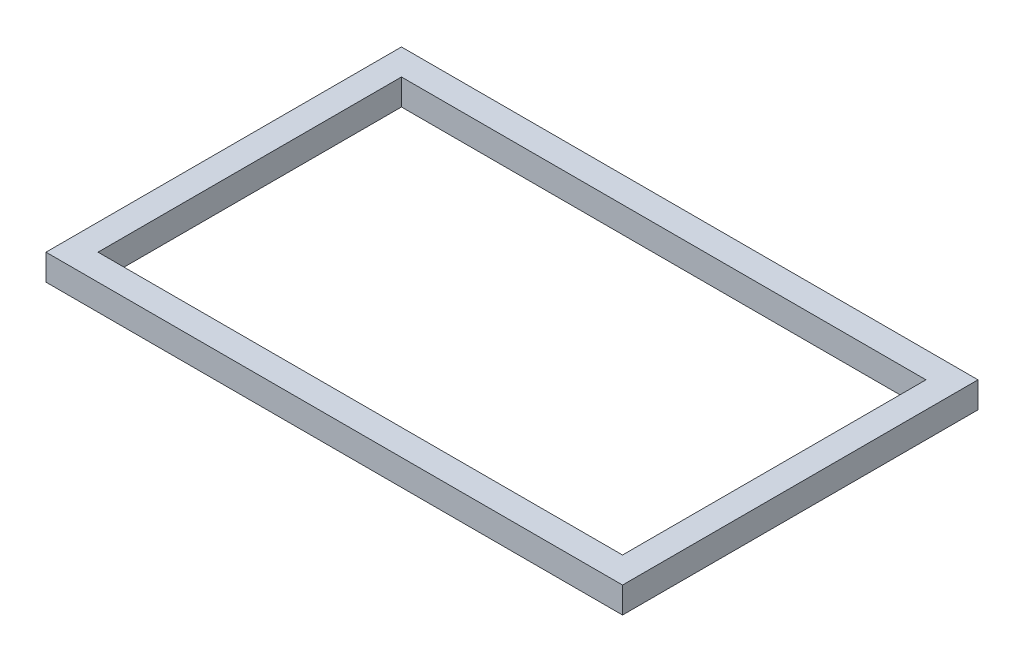
ISO-10303-21;
HEADER;
FILE_DESCRIPTION(('STEP AP214'),'2;1');
FILE_NAME('part.step','',(''),(''),'','','');
FILE_SCHEMA(('AUTOMOTIVE_DESIGN { 1 0 10303 214 1 1 1 1 }'));
ENDSEC;
DATA;
#1=APPLICATION_CONTEXT('core data for automotive mechanical design processes');
#2=APPLICATION_PROTOCOL_DEFINITION('international standard','automotive_design',2000,#1);
#3=PRODUCT_CONTEXT('',#1,'mechanical');
#4=PRODUCT('Part','Part','',(#3));
#5=PRODUCT_RELATED_PRODUCT_CATEGORY('part','',(#4));
#6=PRODUCT_DEFINITION_FORMATION('','',#4);
#7=PRODUCT_DEFINITION_CONTEXT('part definition',#1,'design');
#8=PRODUCT_DEFINITION('design','',#6,#7);
#9=PRODUCT_DEFINITION_SHAPE('','',#8);
#10=(LENGTH_UNIT() NAMED_UNIT(*) SI_UNIT(.MILLI.,.METRE.));
#11=(NAMED_UNIT(*) PLANE_ANGLE_UNIT() SI_UNIT($,.RADIAN.));
#12=(NAMED_UNIT(*) SI_UNIT($,.STERADIAN.) SOLID_ANGLE_UNIT());
#13=UNCERTAINTY_MEASURE_WITH_UNIT(LENGTH_MEASURE(1.E-05),#10,'distance_accuracy_value','');
#14=(GEOMETRIC_REPRESENTATION_CONTEXT(3) GLOBAL_UNCERTAINTY_ASSIGNED_CONTEXT((#13)) GLOBAL_UNIT_ASSIGNED_CONTEXT((#10,
#11,#12)) REPRESENTATION_CONTEXT('',''));
#15=CARTESIAN_POINT('',(0.,0.,0.));
#16=DIRECTION('',(0.,0.,1.));
#17=DIRECTION('',(1.,0.,0.));
#18=AXIS2_PLACEMENT_3D('',#15,#16,#17);
#19=CARTESIAN_POINT('',(0.,18.,0.));
#20=DIRECTION('',(0.,1.,0.));
#21=DIRECTION('',(0.,0.,1.));
#22=AXIS2_PLACEMENT_3D('',#19,#20,#21);
#23=PLANE('',#22);
#24=DIRECTION('',(0.,0.,1.));
#25=VECTOR('',#24,1.);
#26=CARTESIAN_POINT('',(-149.426787880863,18.,-98.2958552607932));
#27=LINE('',#26,#25);
#28=CARTESIAN_POINT('',(-149.426787880863,18.,-98.2958552607932));
#29=VERTEX_POINT('',#28);
#30=CARTESIAN_POINT('',(-149.426787880863,18.,147.704144739207));
#31=VERTEX_POINT('',#30);
#32=EDGE_CURVE('E153',#29,#31,#27,.T.);
#33=ORIENTED_EDGE('',*,*,#32,.T.);
#34=DIRECTION('',(1.,0.,0.));
#35=VECTOR('',#34,1.);
#36=CARTESIAN_POINT('',(-149.426787880863,18.,147.704144739207));
#37=LINE('',#36,#35);
#38=CARTESIAN_POINT('',(249.573212119137,18.,147.704144739207));
#39=VERTEX_POINT('',#38);
#40=EDGE_CURVE('E157',#31,#39,#37,.T.);
#41=ORIENTED_EDGE('',*,*,#40,.T.);
#42=DIRECTION('',(0.,0.,-1.));
#43=VECTOR('',#42,1.);
#44=CARTESIAN_POINT('',(249.573212119137,18.,-98.2958552607932));
#45=LINE('',#44,#43);
#46=CARTESIAN_POINT('',(249.573212119137,18.,-98.2958552607932));
#47=VERTEX_POINT('',#46);
#48=EDGE_CURVE('E161',#39,#47,#45,.T.);
#49=ORIENTED_EDGE('',*,*,#48,.T.);
#50=DIRECTION('',(-1.,0.,0.));
#51=VECTOR('',#50,1.);
#52=CARTESIAN_POINT('',(-149.426787880863,18.,-98.2958552607932));
#53=LINE('',#52,#51);
#54=EDGE_CURVE('E164',#47,#29,#53,.T.);
#55=ORIENTED_EDGE('',*,*,#54,.T.);
#56=EDGE_LOOP('',(#33,#41,#49,#55));
#57=FACE_BOUND('',#56,.T.);
#58=DIRECTION('',(0.,0.,1.));
#59=VECTOR('',#58,1.);
#60=CARTESIAN_POINT('',(-131.426787880863,18.,-80.2958552607932));
#61=LINE('',#60,#59);
#62=CARTESIAN_POINT('',(-131.426787880863,18.,-80.2958552607932));
#63=VERTEX_POINT('',#62);
#64=CARTESIAN_POINT('',(-131.426787880863,18.,129.704144739207));
#65=VERTEX_POINT('',#64);
#66=EDGE_CURVE('E114',#63,#65,#61,.T.);
#67=ORIENTED_EDGE('',*,*,#66,.F.);
#68=DIRECTION('',(-1.,0.,0.));
#69=VECTOR('',#68,1.);
#70=CARTESIAN_POINT('',(-131.426787880863,18.,-80.2958552607932));
#71=LINE('',#70,#69);
#72=CARTESIAN_POINT('',(231.573212119137,18.,-80.2958552607932));
#73=VERTEX_POINT('',#72);
#74=EDGE_CURVE('E105',#73,#63,#71,.T.);
#75=ORIENTED_EDGE('',*,*,#74,.F.);
#76=DIRECTION('',(0.,0.,-1.));
#77=VECTOR('',#76,1.);
#78=CARTESIAN_POINT('',(231.573212119137,18.,-80.2958552607932));
#79=LINE('',#78,#77);
#80=CARTESIAN_POINT('',(231.573212119137,18.,129.704144739207));
#81=VERTEX_POINT('',#80);
#82=EDGE_CURVE('E131',#81,#73,#79,.T.);
#83=ORIENTED_EDGE('',*,*,#82,.F.);
#84=DIRECTION('',(1.,0.,0.));
#85=VECTOR('',#84,1.);
#86=CARTESIAN_POINT('',(-131.426787880863,18.,129.704144739207));
#87=LINE('',#86,#85);
#88=EDGE_CURVE('E127',#65,#81,#87,.T.);
#89=ORIENTED_EDGE('',*,*,#88,.F.);
#90=EDGE_LOOP('',(#67,#75,#83,#89));
#91=FACE_BOUND('',#90,.T.);
#92=ADVANCED_FACE('F39',(#57,#91),#23,.T.);
#93=CARTESIAN_POINT('',(0.,0.,0.));
#94=DIRECTION('',(0.,1.,0.));
#95=DIRECTION('',(0.,0.,1.));
#96=AXIS2_PLACEMENT_3D('',#93,#94,#95);
#97=PLANE('',#96);
#98=DIRECTION('',(0.,0.,1.));
#99=VECTOR('',#98,1.);
#100=CARTESIAN_POINT('',(-149.426787880863,0.,-98.2958552607932));
#101=LINE('',#100,#99);
#102=CARTESIAN_POINT('',(-149.426787880863,0.,-98.2958552607932));
#103=VERTEX_POINT('',#102);
#104=CARTESIAN_POINT('',(-149.426787880863,0.,147.704144739207));
#105=VERTEX_POINT('',#104);
#106=EDGE_CURVE('E123',#103,#105,#101,.T.);
#107=ORIENTED_EDGE('',*,*,#106,.F.);
#108=DIRECTION('',(-1.,0.,0.));
#109=VECTOR('',#108,1.);
#110=CARTESIAN_POINT('',(-149.426787880863,0.,-98.2958552607932));
#111=LINE('',#110,#109);
#112=CARTESIAN_POINT('',(249.573212119137,0.,-98.2958552607932));
#113=VERTEX_POINT('',#112);
#114=EDGE_CURVE('E158',#113,#103,#111,.T.);
#115=ORIENTED_EDGE('',*,*,#114,.F.);
#116=DIRECTION('',(0.,0.,-1.));
#117=VECTOR('',#116,1.);
#118=CARTESIAN_POINT('',(249.573212119137,0.,-98.2958552607932));
#119=LINE('',#118,#117);
#120=CARTESIAN_POINT('',(249.573212119137,0.,147.704144739207));
#121=VERTEX_POINT('',#120);
#122=EDGE_CURVE('E174',#121,#113,#119,.T.);
#123=ORIENTED_EDGE('',*,*,#122,.F.);
#124=DIRECTION('',(1.,0.,0.));
#125=VECTOR('',#124,1.);
#126=CARTESIAN_POINT('',(-149.426787880863,0.,147.704144739207));
#127=LINE('',#126,#125);
#128=EDGE_CURVE('E171',#105,#121,#127,.T.);
#129=ORIENTED_EDGE('',*,*,#128,.F.);
#130=EDGE_LOOP('',(#107,#115,#123,#129));
#131=FACE_BOUND('',#130,.T.);
#132=DIRECTION('',(-1.,0.,0.));
#133=VECTOR('',#132,1.);
#134=CARTESIAN_POINT('',(-131.426787880863,0.,-80.2958552607932));
#135=LINE('',#134,#133);
#136=CARTESIAN_POINT('',(231.573212119137,0.,-80.2958552607932));
#137=VERTEX_POINT('',#136);
#138=CARTESIAN_POINT('',(-131.426787880863,0.,-80.2958552607932));
#139=VERTEX_POINT('',#138);
#140=EDGE_CURVE('E63',#137,#139,#135,.T.);
#141=ORIENTED_EDGE('',*,*,#140,.T.);
#142=DIRECTION('',(0.,0.,1.));
#143=VECTOR('',#142,1.);
#144=CARTESIAN_POINT('',(-131.426787880863,0.,-80.2958552607932));
#145=LINE('',#144,#143);
#146=CARTESIAN_POINT('',(-131.426787880863,0.,129.704144739207));
#147=VERTEX_POINT('',#146);
#148=EDGE_CURVE('E121',#139,#147,#145,.T.);
#149=ORIENTED_EDGE('',*,*,#148,.T.);
#150=DIRECTION('',(1.,0.,0.));
#151=VECTOR('',#150,1.);
#152=CARTESIAN_POINT('',(-131.426787880863,0.,129.704144739207));
#153=LINE('',#152,#151);
#154=CARTESIAN_POINT('',(231.573212119137,0.,129.704144739207));
#155=VERTEX_POINT('',#154);
#156=EDGE_CURVE('E140',#147,#155,#153,.T.);
#157=ORIENTED_EDGE('',*,*,#156,.T.);
#158=DIRECTION('',(0.,0.,-1.));
#159=VECTOR('',#158,1.);
#160=CARTESIAN_POINT('',(231.573212119137,0.,-80.2958552607932));
#161=LINE('',#160,#159);
#162=EDGE_CURVE('E115',#155,#137,#161,.T.);
#163=ORIENTED_EDGE('',*,*,#162,.T.);
#164=EDGE_LOOP('',(#141,#149,#157,#163));
#165=FACE_BOUND('',#164,.T.);
#166=ADVANCED_FACE('F197',(#131,#165),#97,.F.);
#167=CARTESIAN_POINT('',(-149.426787880863,18.,-98.2958552607932));
#168=DIRECTION('',(1.,0.,0.));
#169=DIRECTION('',(0.,0.,-1.));
#170=AXIS2_PLACEMENT_3D('',#167,#168,#169);
#171=PLANE('',#170);
#172=ORIENTED_EDGE('',*,*,#106,.T.);
#173=DIRECTION('',(0.,-1.,0.));
#174=VECTOR('',#173,1.);
#175=CARTESIAN_POINT('',(-149.426787880863,18.,147.704144739207));
#176=LINE('',#175,#174);
#177=EDGE_CURVE('E11',#31,#105,#176,.T.);
#178=ORIENTED_EDGE('',*,*,#177,.F.);
#179=ORIENTED_EDGE('',*,*,#32,.F.);
#180=DIRECTION('',(0.,-1.,0.));
#181=VECTOR('',#180,1.);
#182=CARTESIAN_POINT('',(-149.426787880863,18.,-98.2958552607932));
#183=LINE('',#182,#181);
#184=EDGE_CURVE('E167',#29,#103,#183,.T.);
#185=ORIENTED_EDGE('',*,*,#184,.T.);
#186=EDGE_LOOP('',(#172,#178,#179,#185));
#187=FACE_BOUND('',#186,.T.);
#188=ADVANCED_FACE('F41',(#187),#171,.F.);
#189=CARTESIAN_POINT('',(-149.426787880863,18.,147.704144739207));
#190=DIRECTION('',(0.,0.,-1.));
#191=DIRECTION('',(-1.,0.,0.));
#192=AXIS2_PLACEMENT_3D('',#189,#190,#191);
#193=PLANE('',#192);
#194=ORIENTED_EDGE('',*,*,#128,.T.);
#195=DIRECTION('',(0.,-1.,0.));
#196=VECTOR('',#195,1.);
#197=CARTESIAN_POINT('',(249.573212119137,18.,147.704144739207));
#198=LINE('',#197,#196);
#199=EDGE_CURVE('E48',#39,#121,#198,.T.);
#200=ORIENTED_EDGE('',*,*,#199,.F.);
#201=ORIENTED_EDGE('',*,*,#40,.F.);
#202=ORIENTED_EDGE('',*,*,#177,.T.);
#203=EDGE_LOOP('',(#194,#200,#201,#202));
#204=FACE_BOUND('',#203,.T.);
#205=ADVANCED_FACE('F207',(#204),#193,.F.);
#206=CARTESIAN_POINT('',(249.573212119137,18.,-98.2958552607932));
#207=DIRECTION('',(-1.,0.,0.));
#208=DIRECTION('',(0.,0.,1.));
#209=AXIS2_PLACEMENT_3D('',#206,#207,#208);
#210=PLANE('',#209);
#211=ORIENTED_EDGE('',*,*,#122,.T.);
#212=DIRECTION('',(0.,-1.,0.));
#213=VECTOR('',#212,1.);
#214=CARTESIAN_POINT('',(249.573212119137,18.,-98.2958552607932));
#215=LINE('',#214,#213);
#216=EDGE_CURVE('E182',#47,#113,#215,.T.);
#217=ORIENTED_EDGE('',*,*,#216,.F.);
#218=ORIENTED_EDGE('',*,*,#48,.F.);
#219=ORIENTED_EDGE('',*,*,#199,.T.);
#220=EDGE_LOOP('',(#211,#217,#218,#219));
#221=FACE_BOUND('',#220,.T.);
#222=ADVANCED_FACE('F191',(#221),#210,.F.);
#223=CARTESIAN_POINT('',(-149.426787880863,18.,-98.2958552607932));
#224=DIRECTION('',(0.,0.,1.));
#225=DIRECTION('',(1.,0.,0.));
#226=AXIS2_PLACEMENT_3D('',#223,#224,#225);
#227=PLANE('',#226);
#228=ORIENTED_EDGE('',*,*,#114,.T.);
#229=ORIENTED_EDGE('',*,*,#184,.F.);
#230=ORIENTED_EDGE('',*,*,#54,.F.);
#231=ORIENTED_EDGE('',*,*,#216,.T.);
#232=EDGE_LOOP('',(#228,#229,#230,#231));
#233=FACE_BOUND('',#232,.T.);
#234=ADVANCED_FACE('F201',(#233),#227,.F.);
#235=CARTESIAN_POINT('',(-131.426787880863,18.,-80.2958552607932));
#236=DIRECTION('',(0.,0.,1.));
#237=DIRECTION('',(1.,0.,0.));
#238=AXIS2_PLACEMENT_3D('',#235,#236,#237);
#239=PLANE('',#238);
#240=ORIENTED_EDGE('',*,*,#140,.F.);
#241=DIRECTION('',(0.,-1.,0.));
#242=VECTOR('',#241,1.);
#243=CARTESIAN_POINT('',(231.573212119137,18.,-80.2958552607932));
#244=LINE('',#243,#242);
#245=EDGE_CURVE('E109',#73,#137,#244,.T.);
#246=ORIENTED_EDGE('',*,*,#245,.F.);
#247=ORIENTED_EDGE('',*,*,#74,.T.);
#248=DIRECTION('',(0.,-1.,0.));
#249=VECTOR('',#248,1.);
#250=CARTESIAN_POINT('',(-131.426787880863,18.,-80.2958552607932));
#251=LINE('',#250,#249);
#252=EDGE_CURVE('E108',#63,#139,#251,.T.);
#253=ORIENTED_EDGE('',*,*,#252,.T.);
#254=EDGE_LOOP('',(#240,#246,#247,#253));
#255=FACE_BOUND('',#254,.T.);
#256=ADVANCED_FACE('F107',(#255),#239,.T.);
#257=CARTESIAN_POINT('',(-131.426787880863,18.,-80.2958552607932));
#258=DIRECTION('',(1.,0.,0.));
#259=DIRECTION('',(0.,0.,-1.));
#260=AXIS2_PLACEMENT_3D('',#257,#258,#259);
#261=PLANE('',#260);
#262=ORIENTED_EDGE('',*,*,#148,.F.);
#263=ORIENTED_EDGE('',*,*,#252,.F.);
#264=ORIENTED_EDGE('',*,*,#66,.T.);
#265=DIRECTION('',(0.,-1.,0.));
#266=VECTOR('',#265,1.);
#267=CARTESIAN_POINT('',(-131.426787880863,18.,129.704144739207));
#268=LINE('',#267,#266);
#269=EDGE_CURVE('E124',#65,#147,#268,.T.);
#270=ORIENTED_EDGE('',*,*,#269,.T.);
#271=EDGE_LOOP('',(#262,#263,#264,#270));
#272=FACE_BOUND('',#271,.T.);
#273=ADVANCED_FACE('F118',(#272),#261,.T.);
#274=CARTESIAN_POINT('',(-131.426787880863,18.,129.704144739207));
#275=DIRECTION('',(0.,0.,-1.));
#276=DIRECTION('',(-1.,0.,0.));
#277=AXIS2_PLACEMENT_3D('',#274,#275,#276);
#278=PLANE('',#277);
#279=ORIENTED_EDGE('',*,*,#156,.F.);
#280=ORIENTED_EDGE('',*,*,#269,.F.);
#281=ORIENTED_EDGE('',*,*,#88,.T.);
#282=DIRECTION('',(0.,-1.,0.));
#283=VECTOR('',#282,1.);
#284=CARTESIAN_POINT('',(231.573212119137,18.,129.704144739207));
#285=LINE('',#284,#283);
#286=EDGE_CURVE('E55',#81,#155,#285,.T.);
#287=ORIENTED_EDGE('',*,*,#286,.T.);
#288=EDGE_LOOP('',(#279,#280,#281,#287));
#289=FACE_BOUND('',#288,.T.);
#290=ADVANCED_FACE('F230',(#289),#278,.T.);
#291=CARTESIAN_POINT('',(231.573212119137,18.,-80.2958552607932));
#292=DIRECTION('',(-1.,0.,0.));
#293=DIRECTION('',(0.,0.,1.));
#294=AXIS2_PLACEMENT_3D('',#291,#292,#293);
#295=PLANE('',#294);
#296=ORIENTED_EDGE('',*,*,#162,.F.);
#297=ORIENTED_EDGE('',*,*,#286,.F.);
#298=ORIENTED_EDGE('',*,*,#82,.T.);
#299=ORIENTED_EDGE('',*,*,#245,.T.);
#300=EDGE_LOOP('',(#296,#297,#298,#299));
#301=FACE_BOUND('',#300,.T.);
#302=ADVANCED_FACE('F234',(#301),#295,.T.);
#303=CLOSED_SHELL('',(#92,#166,#188,#205,#222,#234,#256,#273,#290,#302));
#304=MANIFOLD_SOLID_BREP('B2',#303);
#305=ADVANCED_BREP_SHAPE_REPRESENTATION('',(#18,#304),#14);
#306=SHAPE_DEFINITION_REPRESENTATION(#9,#305);
ENDSEC;
END-ISO-10303-21;
